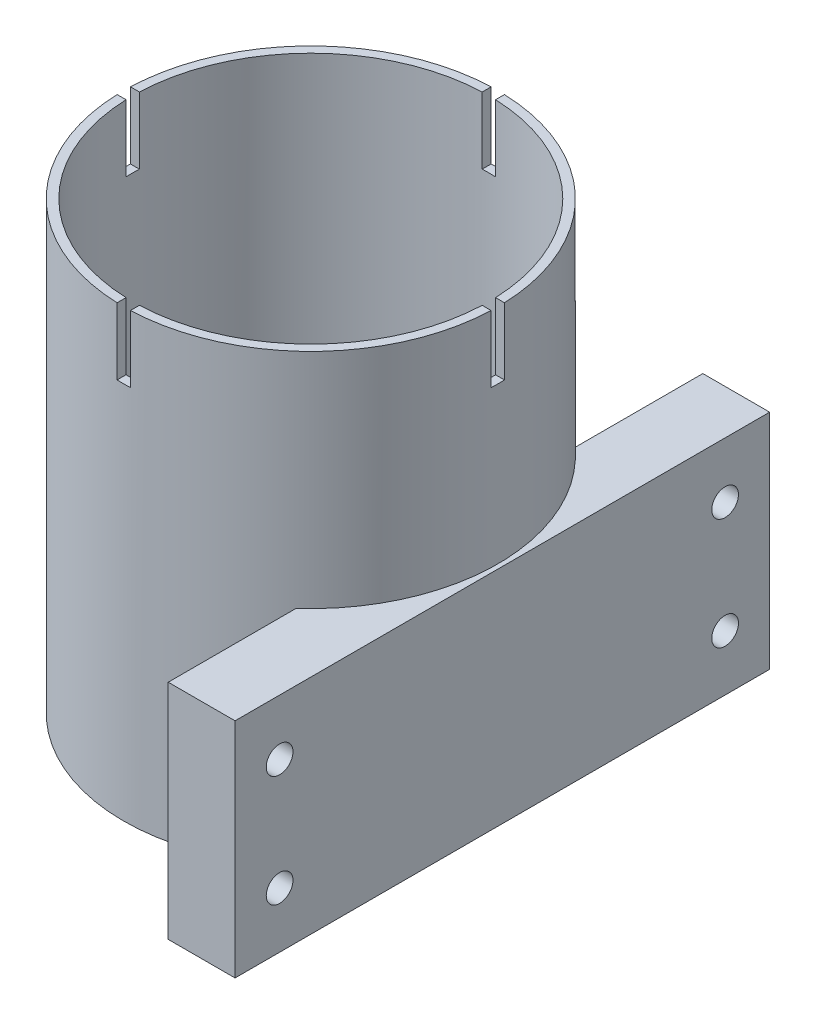
ISO-10303-21;
HEADER;
FILE_DESCRIPTION(('STEP AP214'),'2;1');
FILE_NAME('part.step','',(''),(''),'','','');
FILE_SCHEMA(('AUTOMOTIVE_DESIGN { 1 0 10303 214 1 1 1 1 }'));
ENDSEC;
DATA;
#1=APPLICATION_CONTEXT('core data for automotive mechanical design processes');
#2=APPLICATION_PROTOCOL_DEFINITION('international standard','automotive_design',2000,#1);
#3=PRODUCT_CONTEXT('',#1,'mechanical');
#4=PRODUCT('Part','Part','',(#3));
#5=PRODUCT_RELATED_PRODUCT_CATEGORY('part','',(#4));
#6=PRODUCT_DEFINITION_FORMATION('','',#4);
#7=PRODUCT_DEFINITION_CONTEXT('part definition',#1,'design');
#8=PRODUCT_DEFINITION('design','',#6,#7);
#9=PRODUCT_DEFINITION_SHAPE('','',#8);
#10=(LENGTH_UNIT() NAMED_UNIT(*) SI_UNIT(.MILLI.,.METRE.));
#11=(NAMED_UNIT(*) PLANE_ANGLE_UNIT() SI_UNIT($,.RADIAN.));
#12=(NAMED_UNIT(*) SI_UNIT($,.STERADIAN.) SOLID_ANGLE_UNIT());
#13=UNCERTAINTY_MEASURE_WITH_UNIT(LENGTH_MEASURE(1.E-05),#10,'distance_accuracy_value','');
#14=(GEOMETRIC_REPRESENTATION_CONTEXT(3) GLOBAL_UNCERTAINTY_ASSIGNED_CONTEXT((#13)) GLOBAL_UNIT_ASSIGNED_CONTEXT((#10,
#11,#12)) REPRESENTATION_CONTEXT('',''));
#15=CARTESIAN_POINT('',(0.,0.,0.));
#16=DIRECTION('',(0.,0.,1.));
#17=DIRECTION('',(1.,0.,0.));
#18=AXIS2_PLACEMENT_3D('',#15,#16,#17);
#19=CARTESIAN_POINT('',(0.,100.,0.));
#20=DIRECTION('',(0.,-1.,0.));
#21=DIRECTION('',(0.,0.,-1.));
#22=AXIS2_PLACEMENT_3D('',#19,#20,#21);
#23=CYLINDRICAL_SURFACE('',#22,42.);
#24=CARTESIAN_POINT('',(0.,85.,0.));
#25=DIRECTION('',(0.,-1.,0.));
#26=DIRECTION('',(0.,0.,-1.));
#27=AXIS2_PLACEMENT_3D('',#24,#25,#26);
#28=CIRCLE('',#27,42.);
#29=CARTESIAN_POINT('',(41.9732057388997,85.,-1.5));
#30=VERTEX_POINT('',#29);
#31=CARTESIAN_POINT('',(41.9732057388997,85.,1.5));
#32=VERTEX_POINT('',#31);
#33=EDGE_CURVE('E275',#30,#32,#28,.T.);
#34=ORIENTED_EDGE('',*,*,#33,.T.);
#35=DIRECTION('',(0.,-1.,0.));
#36=VECTOR('',#35,1.);
#37=CARTESIAN_POINT('',(41.9732057388997,100.,1.5));
#38=LINE('',#37,#36);
#39=CARTESIAN_POINT('',(41.9732057388997,100.,1.5));
#40=VERTEX_POINT('',#39);
#41=EDGE_CURVE('E297',#32,#40,#38,.F.);
#42=ORIENTED_EDGE('',*,*,#41,.T.);
#43=CARTESIAN_POINT('',(0.,100.,0.));
#44=DIRECTION('',(0.,1.,0.));
#45=DIRECTION('',(0.,0.,1.));
#46=AXIS2_PLACEMENT_3D('',#43,#44,#45);
#47=CIRCLE('',#46,42.);
#48=CARTESIAN_POINT('',(1.50000000000001,100.,41.9732057388997));
#49=VERTEX_POINT('',#48);
#50=EDGE_CURVE('E317',#49,#40,#47,.T.);
#51=ORIENTED_EDGE('',*,*,#50,.F.);
#52=DIRECTION('',(0.,-1.,0.));
#53=VECTOR('',#52,1.);
#54=CARTESIAN_POINT('',(1.50000000000001,100.,41.9732057388997));
#55=LINE('',#54,#53);
#56=CARTESIAN_POINT('',(1.50000000000001,85.,41.9732057388997));
#57=VERTEX_POINT('',#56);
#58=EDGE_CURVE('E294',#49,#57,#55,.T.);
#59=ORIENTED_EDGE('',*,*,#58,.T.);
#60=CARTESIAN_POINT('',(-1.5,85.,41.9732057388997));
#61=VERTEX_POINT('',#60);
#62=EDGE_CURVE('E380',#57,#61,#28,.T.);
#63=ORIENTED_EDGE('',*,*,#62,.T.);
#64=DIRECTION('',(0.,-1.,0.));
#65=VECTOR('',#64,1.);
#66=CARTESIAN_POINT('',(-1.5,100.,41.9732057388997));
#67=LINE('',#66,#65);
#68=CARTESIAN_POINT('',(-1.49999999999999,100.,41.9732057388997));
#69=VERTEX_POINT('',#68);
#70=EDGE_CURVE('E291',#61,#69,#67,.F.);
#71=ORIENTED_EDGE('',*,*,#70,.T.);
#72=CARTESIAN_POINT('',(-41.9732057388997,100.,1.5));
#73=VERTEX_POINT('',#72);
#74=EDGE_CURVE('E322',#73,#69,#47,.T.);
#75=ORIENTED_EDGE('',*,*,#74,.F.);
#76=DIRECTION('',(0.,-1.,0.));
#77=VECTOR('',#76,1.);
#78=CARTESIAN_POINT('',(-41.9732057388997,100.,1.5));
#79=LINE('',#78,#77);
#80=CARTESIAN_POINT('',(-41.9732057388997,85.,1.5));
#81=VERTEX_POINT('',#80);
#82=EDGE_CURVE('E288',#73,#81,#79,.T.);
#83=ORIENTED_EDGE('',*,*,#82,.T.);
#84=CARTESIAN_POINT('',(-41.9732057388997,85.,-1.5));
#85=VERTEX_POINT('',#84);
#86=EDGE_CURVE('E274',#81,#85,#28,.T.);
#87=ORIENTED_EDGE('',*,*,#86,.T.);
#88=DIRECTION('',(0.,-1.,0.));
#89=VECTOR('',#88,1.);
#90=CARTESIAN_POINT('',(-41.9732057388997,100.,-1.5));
#91=LINE('',#90,#89);
#92=CARTESIAN_POINT('',(-41.9732057388997,100.,-1.5));
#93=VERTEX_POINT('',#92);
#94=EDGE_CURVE('E285',#85,#93,#91,.F.);
#95=ORIENTED_EDGE('',*,*,#94,.T.);
#96=CARTESIAN_POINT('',(-1.50000000000001,100.,-41.9732057388997));
#97=VERTEX_POINT('',#96);
#98=EDGE_CURVE('E421',#97,#93,#47,.T.);
#99=ORIENTED_EDGE('',*,*,#98,.F.);
#100=DIRECTION('',(0.,-1.,0.));
#101=VECTOR('',#100,1.);
#102=CARTESIAN_POINT('',(-1.50000000000001,100.,-41.9732057388997));
#103=LINE('',#102,#101);
#104=CARTESIAN_POINT('',(-1.50000000000001,85.,-41.9732057388997));
#105=VERTEX_POINT('',#104);
#106=EDGE_CURVE('E282',#97,#105,#103,.T.);
#107=ORIENTED_EDGE('',*,*,#106,.T.);
#108=CARTESIAN_POINT('',(1.5,85.,-41.9732057388997));
#109=VERTEX_POINT('',#108);
#110=EDGE_CURVE('E257',#105,#109,#28,.T.);
#111=ORIENTED_EDGE('',*,*,#110,.T.);
#112=DIRECTION('',(0.,-1.,0.));
#113=VECTOR('',#112,1.);
#114=CARTESIAN_POINT('',(1.5,100.,-41.9732057388997));
#115=LINE('',#114,#113);
#116=CARTESIAN_POINT('',(1.49999999999999,100.,-41.9732057388997));
#117=VERTEX_POINT('',#116);
#118=EDGE_CURVE('E279',#109,#117,#115,.F.);
#119=ORIENTED_EDGE('',*,*,#118,.T.);
#120=CARTESIAN_POINT('',(41.9732057388997,100.,-1.5));
#121=VERTEX_POINT('',#120);
#122=EDGE_CURVE('E321',#121,#117,#47,.T.);
#123=ORIENTED_EDGE('',*,*,#122,.F.);
#124=DIRECTION('',(0.,-1.,0.));
#125=VECTOR('',#124,1.);
#126=CARTESIAN_POINT('',(41.9732057388997,100.,-1.5));
#127=LINE('',#126,#125);
#128=EDGE_CURVE('E276',#121,#30,#127,.T.);
#129=ORIENTED_EDGE('',*,*,#128,.T.);
#130=EDGE_LOOP('',(#34,#42,#51,#59,#63,#71,#75,#83,#87,#95,#99,#107,#111,#119,#123,#129));
#131=FACE_BOUND('',#130,.T.);
#132=DIRECTION('',(0.,-1.,0.));
#133=VECTOR('',#132,1.);
#134=CARTESIAN_POINT('',(28.,50.,-31.3049516849971));
#135=LINE('',#134,#133);
#136=CARTESIAN_POINT('',(28.,50.,-31.3049516849971));
#137=VERTEX_POINT('',#136);
#138=CARTESIAN_POINT('',(28.,0.,-31.3049516849971));
#139=VERTEX_POINT('',#138);
#140=EDGE_CURVE('E229',#137,#139,#135,.T.);
#141=ORIENTED_EDGE('',*,*,#140,.T.);
#142=CARTESIAN_POINT('',(0.,0.,0.));
#143=DIRECTION('',(0.,1.,0.));
#144=DIRECTION('',(0.,0.,1.));
#145=AXIS2_PLACEMENT_3D('',#142,#143,#144);
#146=CIRCLE('',#145,42.);
#147=CARTESIAN_POINT('',(28.,0.,31.3049516849971));
#148=VERTEX_POINT('',#147);
#149=EDGE_CURVE('E311',#139,#148,#146,.T.);
#150=ORIENTED_EDGE('',*,*,#149,.T.);
#151=DIRECTION('',(0.,-1.,0.));
#152=VECTOR('',#151,1.);
#153=CARTESIAN_POINT('',(28.,50.,31.3049516849971));
#154=LINE('',#153,#152);
#155=CARTESIAN_POINT('',(28.,50.,31.3049516849971));
#156=VERTEX_POINT('',#155);
#157=EDGE_CURVE('E48',#156,#148,#154,.T.);
#158=ORIENTED_EDGE('',*,*,#157,.F.);
#159=CARTESIAN_POINT('',(0.,50.,0.));
#160=DIRECTION('',(0.,-1.,0.));
#161=DIRECTION('',(0.,0.,-1.));
#162=AXIS2_PLACEMENT_3D('',#159,#160,#161);
#163=CIRCLE('',#162,42.);
#164=EDGE_CURVE('E52',#137,#156,#163,.T.);
#165=ORIENTED_EDGE('',*,*,#164,.F.);
#166=EDGE_LOOP('',(#141,#150,#158,#165));
#167=FACE_BOUND('',#166,.T.);
#168=ADVANCED_FACE('F34',(#131,#167),#23,.T.);
#169=CARTESIAN_POINT('',(0.,100.,0.));
#170=DIRECTION('',(0.,1.,0.));
#171=DIRECTION('',(0.,0.,1.));
#172=AXIS2_PLACEMENT_3D('',#169,#170,#171);
#173=PLANE('',#172);
#174=DIRECTION('',(1.,0.,0.));
#175=VECTOR('',#174,1.);
#176=CARTESIAN_POINT('',(1.5,100.,1.5));
#177=LINE('',#176,#175);
#178=CARTESIAN_POINT('',(39.9718651053463,100.,1.5));
#179=VERTEX_POINT('',#178);
#180=EDGE_CURVE('E239',#179,#40,#177,.T.);
#181=ORIENTED_EDGE('',*,*,#180,.F.);
#182=CARTESIAN_POINT('',(0.,100.,0.));
#183=DIRECTION('',(0.,1.,0.));
#184=DIRECTION('',(0.,0.,1.));
#185=AXIS2_PLACEMENT_3D('',#182,#183,#184);
#186=CIRCLE('',#185,40.);
#187=CARTESIAN_POINT('',(1.5,100.,39.9718651053463));
#188=VERTEX_POINT('',#187);
#189=EDGE_CURVE('E312',#188,#179,#186,.T.);
#190=ORIENTED_EDGE('',*,*,#189,.F.);
#191=DIRECTION('',(0.,0.,-1.));
#192=VECTOR('',#191,1.);
#193=CARTESIAN_POINT('',(1.5,100.,1.5));
#194=LINE('',#193,#192);
#195=EDGE_CURVE('E269',#49,#188,#194,.T.);
#196=ORIENTED_EDGE('',*,*,#195,.F.);
#197=ORIENTED_EDGE('',*,*,#50,.T.);
#198=EDGE_LOOP('',(#181,#190,#196,#197));
#199=FACE_BOUND('',#198,.T.);
#200=ADVANCED_FACE('F373',(#199),#173,.T.);
#201=DIRECTION('',(0.,0.,1.));
#202=VECTOR('',#201,1.);
#203=CARTESIAN_POINT('',(-1.5,100.,1.5));
#204=LINE('',#203,#202);
#205=CARTESIAN_POINT('',(-1.5,100.,39.9718651053463));
#206=VERTEX_POINT('',#205);
#207=EDGE_CURVE('E267',#206,#69,#204,.T.);
#208=ORIENTED_EDGE('',*,*,#207,.F.);
#209=CARTESIAN_POINT('',(-39.9718651053463,100.,1.5));
#210=VERTEX_POINT('',#209);
#211=EDGE_CURVE('E316',#210,#206,#186,.T.);
#212=ORIENTED_EDGE('',*,*,#211,.F.);
#213=DIRECTION('',(1.,0.,0.));
#214=VECTOR('',#213,1.);
#215=CARTESIAN_POINT('',(-52.9403389802906,100.,1.5));
#216=LINE('',#215,#214);
#217=EDGE_CURVE('E265',#73,#210,#216,.T.);
#218=ORIENTED_EDGE('',*,*,#217,.F.);
#219=ORIENTED_EDGE('',*,*,#74,.T.);
#220=EDGE_LOOP('',(#208,#212,#218,#219));
#221=FACE_BOUND('',#220,.T.);
#222=ADVANCED_FACE('F399',(#221),#173,.T.);
#223=DIRECTION('',(-1.,0.,0.));
#224=VECTOR('',#223,1.);
#225=CARTESIAN_POINT('',(-52.9403389802906,100.,-1.5));
#226=LINE('',#225,#224);
#227=CARTESIAN_POINT('',(-39.9718651053463,100.,-1.5));
#228=VERTEX_POINT('',#227);
#229=EDGE_CURVE('E263',#228,#93,#226,.T.);
#230=ORIENTED_EDGE('',*,*,#229,.F.);
#231=CARTESIAN_POINT('',(-1.50000000000001,100.,-39.9718651053463));
#232=VERTEX_POINT('',#231);
#233=EDGE_CURVE('E400',#232,#228,#186,.T.);
#234=ORIENTED_EDGE('',*,*,#233,.F.);
#235=DIRECTION('',(0.,0.,1.));
#236=VECTOR('',#235,1.);
#237=CARTESIAN_POINT('',(-1.50000000000001,100.,-46.2988985871224));
#238=LINE('',#237,#236);
#239=EDGE_CURVE('E261',#97,#232,#238,.T.);
#240=ORIENTED_EDGE('',*,*,#239,.F.);
#241=ORIENTED_EDGE('',*,*,#98,.T.);
#242=EDGE_LOOP('',(#230,#234,#240,#241));
#243=FACE_BOUND('',#242,.T.);
#244=ADVANCED_FACE('F420',(#243),#173,.T.);
#245=DIRECTION('',(0.,0.,-1.));
#246=VECTOR('',#245,1.);
#247=CARTESIAN_POINT('',(1.49999999999999,100.,-46.2988985871224));
#248=LINE('',#247,#246);
#249=CARTESIAN_POINT('',(1.5,100.,-39.9718651053463));
#250=VERTEX_POINT('',#249);
#251=EDGE_CURVE('E259',#250,#117,#248,.T.);
#252=ORIENTED_EDGE('',*,*,#251,.F.);
#253=CARTESIAN_POINT('',(39.9718651053463,100.,-1.5));
#254=VERTEX_POINT('',#253);
#255=EDGE_CURVE('E315',#254,#250,#186,.T.);
#256=ORIENTED_EDGE('',*,*,#255,.F.);
#257=DIRECTION('',(-1.,0.,0.));
#258=VECTOR('',#257,1.);
#259=CARTESIAN_POINT('',(1.5,100.,-1.5));
#260=LINE('',#259,#258);
#261=EDGE_CURVE('E228',#121,#254,#260,.T.);
#262=ORIENTED_EDGE('',*,*,#261,.F.);
#263=ORIENTED_EDGE('',*,*,#122,.T.);
#264=EDGE_LOOP('',(#252,#256,#262,#263));
#265=FACE_BOUND('',#264,.T.);
#266=ADVANCED_FACE('F405',(#265),#173,.T.);
#267=CARTESIAN_POINT('',(0.,0.,0.));
#268=DIRECTION('',(0.,1.,0.));
#269=DIRECTION('',(0.,0.,1.));
#270=AXIS2_PLACEMENT_3D('',#267,#268,#269);
#271=PLANE('',#270);
#272=CARTESIAN_POINT('',(0.,0.,0.));
#273=DIRECTION('',(0.,-1.,0.));
#274=DIRECTION('',(0.,0.,-1.));
#275=AXIS2_PLACEMENT_3D('',#272,#273,#274);
#276=CIRCLE('',#275,10.);
#277=CARTESIAN_POINT('',(0.,0.,-10.));
#278=VERTEX_POINT('',#277);
#279=EDGE_CURVE('E300',#278,#278,#276,.T.);
#280=ORIENTED_EDGE('',*,*,#279,.F.);
#281=EDGE_LOOP('',(#280));
#282=FACE_BOUND('',#281,.T.);
#283=CARTESIAN_POINT('',(0.,0.,30.));
#284=DIRECTION('',(0.,-1.,0.));
#285=DIRECTION('',(0.,0.,-1.));
#286=AXIS2_PLACEMENT_3D('',#283,#284,#285);
#287=CIRCLE('',#286,5.5);
#288=CARTESIAN_POINT('',(0.,0.,24.5));
#289=VERTEX_POINT('',#288);
#290=EDGE_CURVE('E304',#289,#289,#287,.T.);
#291=ORIENTED_EDGE('',*,*,#290,.F.);
#292=EDGE_LOOP('',(#291));
#293=FACE_BOUND('',#292,.T.);
#294=ORIENTED_EDGE('',*,*,#149,.F.);
#295=DIRECTION('',(0.,0.,1.));
#296=VECTOR('',#295,1.);
#297=CARTESIAN_POINT('',(28.,0.,-60.));
#298=LINE('',#297,#296);
#299=CARTESIAN_POINT('',(28.,0.,-60.));
#300=VERTEX_POINT('',#299);
#301=EDGE_CURVE('E205',#300,#139,#298,.T.);
#302=ORIENTED_EDGE('',*,*,#301,.F.);
#303=DIRECTION('',(1.,0.,0.));
#304=VECTOR('',#303,1.);
#305=CARTESIAN_POINT('',(28.,0.,-60.));
#306=LINE('',#305,#304);
#307=CARTESIAN_POINT('',(43.,0.,-60.));
#308=VERTEX_POINT('',#307);
#309=EDGE_CURVE('E219',#300,#308,#306,.T.);
#310=ORIENTED_EDGE('',*,*,#309,.T.);
#311=DIRECTION('',(0.,0.,1.));
#312=VECTOR('',#311,1.);
#313=CARTESIAN_POINT('',(43.,0.,-60.));
#314=LINE('',#313,#312);
#315=CARTESIAN_POINT('',(43.,0.,60.));
#316=VERTEX_POINT('',#315);
#317=EDGE_CURVE('E186',#308,#316,#314,.T.);
#318=ORIENTED_EDGE('',*,*,#317,.T.);
#319=DIRECTION('',(1.,0.,0.));
#320=VECTOR('',#319,1.);
#321=CARTESIAN_POINT('',(28.,0.,60.));
#322=LINE('',#321,#320);
#323=CARTESIAN_POINT('',(28.,0.,60.));
#324=VERTEX_POINT('',#323);
#325=EDGE_CURVE('E223',#324,#316,#322,.T.);
#326=ORIENTED_EDGE('',*,*,#325,.F.);
#327=DIRECTION('',(0.,0.,1.));
#328=VECTOR('',#327,1.);
#329=CARTESIAN_POINT('',(28.,0.,31.3049516849971));
#330=LINE('',#329,#328);
#331=EDGE_CURVE('E208',#148,#324,#330,.T.);
#332=ORIENTED_EDGE('',*,*,#331,.F.);
#333=EDGE_LOOP('',(#294,#302,#310,#318,#326,#332));
#334=FACE_BOUND('',#333,.T.);
#335=ADVANCED_FACE('F444',(#282,#293,#334),#271,.F.);
#336=CARTESIAN_POINT('',(0.,2.,0.));
#337=DIRECTION('',(0.,1.,0.));
#338=DIRECTION('',(0.,0.,1.));
#339=AXIS2_PLACEMENT_3D('',#336,#337,#338);
#340=CYLINDRICAL_SURFACE('',#339,40.);
#341=CARTESIAN_POINT('',(0.,85.,0.));
#342=DIRECTION('',(0.,-1.,0.));
#343=DIRECTION('',(0.,0.,-1.));
#344=AXIS2_PLACEMENT_3D('',#341,#342,#343);
#345=CIRCLE('',#344,40.);
#346=CARTESIAN_POINT('',(-39.9718651053463,85.,-1.5));
#347=VERTEX_POINT('',#346);
#348=CARTESIAN_POINT('',(-39.9718651053463,85.,1.5));
#349=VERTEX_POINT('',#348);
#350=EDGE_CURVE('E331',#347,#349,#345,.F.);
#351=ORIENTED_EDGE('',*,*,#350,.T.);
#352=DIRECTION('',(0.,1.,0.));
#353=VECTOR('',#352,1.);
#354=CARTESIAN_POINT('',(-39.9718651053463,2.,1.5));
#355=LINE('',#354,#353);
#356=EDGE_CURVE('E11',#349,#210,#355,.T.);
#357=ORIENTED_EDGE('',*,*,#356,.T.);
#358=ORIENTED_EDGE('',*,*,#211,.T.);
#359=DIRECTION('',(0.,1.,0.));
#360=VECTOR('',#359,1.);
#361=CARTESIAN_POINT('',(-1.5,2.,39.9718651053463));
#362=LINE('',#361,#360);
#363=CARTESIAN_POINT('',(-1.5,85.,39.9718651053463));
#364=VERTEX_POINT('',#363);
#365=EDGE_CURVE('E345',#206,#364,#362,.F.);
#366=ORIENTED_EDGE('',*,*,#365,.T.);
#367=CARTESIAN_POINT('',(1.5,85.,39.9718651053463));
#368=VERTEX_POINT('',#367);
#369=EDGE_CURVE('E344',#364,#368,#345,.F.);
#370=ORIENTED_EDGE('',*,*,#369,.T.);
#371=DIRECTION('',(0.,1.,0.));
#372=VECTOR('',#371,1.);
#373=CARTESIAN_POINT('',(1.5,2.,39.9718651053463));
#374=LINE('',#373,#372);
#375=EDGE_CURVE('E348',#368,#188,#374,.T.);
#376=ORIENTED_EDGE('',*,*,#375,.T.);
#377=ORIENTED_EDGE('',*,*,#189,.T.);
#378=DIRECTION('',(0.,1.,0.));
#379=VECTOR('',#378,1.);
#380=CARTESIAN_POINT('',(39.9718651053463,2.,1.5));
#381=LINE('',#380,#379);
#382=CARTESIAN_POINT('',(39.9718651053463,85.,1.5));
#383=VERTEX_POINT('',#382);
#384=EDGE_CURVE('E341',#179,#383,#381,.F.);
#385=ORIENTED_EDGE('',*,*,#384,.T.);
#386=CARTESIAN_POINT('',(39.9718651053463,85.,-1.5));
#387=VERTEX_POINT('',#386);
#388=EDGE_CURVE('E332',#383,#387,#345,.F.);
#389=ORIENTED_EDGE('',*,*,#388,.T.);
#390=DIRECTION('',(0.,1.,0.));
#391=VECTOR('',#390,1.);
#392=CARTESIAN_POINT('',(39.9718651053463,2.,-1.5));
#393=LINE('',#392,#391);
#394=EDGE_CURVE('E338',#387,#254,#393,.T.);
#395=ORIENTED_EDGE('',*,*,#394,.T.);
#396=ORIENTED_EDGE('',*,*,#255,.T.);
#397=DIRECTION('',(0.,1.,0.));
#398=VECTOR('',#397,1.);
#399=CARTESIAN_POINT('',(1.5,2.,-39.9718651053463));
#400=LINE('',#399,#398);
#401=CARTESIAN_POINT('',(1.5,85.,-39.9718651053463));
#402=VERTEX_POINT('',#401);
#403=EDGE_CURVE('E330',#250,#402,#400,.F.);
#404=ORIENTED_EDGE('',*,*,#403,.T.);
#405=CARTESIAN_POINT('',(-1.50000000000001,85.,-39.9718651053463));
#406=VERTEX_POINT('',#405);
#407=EDGE_CURVE('E320',#402,#406,#345,.F.);
#408=ORIENTED_EDGE('',*,*,#407,.T.);
#409=DIRECTION('',(0.,1.,0.));
#410=VECTOR('',#409,1.);
#411=CARTESIAN_POINT('',(-1.50000000000001,2.,-39.9718651053463));
#412=LINE('',#411,#410);
#413=EDGE_CURVE('E335',#406,#232,#412,.T.);
#414=ORIENTED_EDGE('',*,*,#413,.T.);
#415=ORIENTED_EDGE('',*,*,#233,.T.);
#416=DIRECTION('',(0.,1.,0.));
#417=VECTOR('',#416,1.);
#418=CARTESIAN_POINT('',(-39.9718651053463,2.,-1.5));
#419=LINE('',#418,#417);
#420=EDGE_CURVE('E41',#228,#347,#419,.F.);
#421=ORIENTED_EDGE('',*,*,#420,.T.);
#422=EDGE_LOOP('',(#351,#357,#358,#366,#370,#376,#377,#385,#389,#395,#396,#404,#408,#414,#415,#421));
#423=FACE_BOUND('',#422,.T.);
#424=CARTESIAN_POINT('',(0.,2.,0.));
#425=DIRECTION('',(0.,1.,0.));
#426=DIRECTION('',(0.,0.,1.));
#427=AXIS2_PLACEMENT_3D('',#424,#425,#426);
#428=CIRCLE('',#427,40.);
#429=CARTESIAN_POINT('',(0.,2.,40.));
#430=VERTEX_POINT('',#429);
#431=EDGE_CURVE('E308',#430,#430,#428,.T.);
#432=ORIENTED_EDGE('',*,*,#431,.F.);
#433=EDGE_LOOP('',(#432));
#434=FACE_BOUND('',#433,.T.);
#435=ADVANCED_FACE('F356',(#423,#434),#340,.F.);
#436=CARTESIAN_POINT('',(0.,2.,0.));
#437=DIRECTION('',(0.,1.,0.));
#438=DIRECTION('',(0.,0.,1.));
#439=AXIS2_PLACEMENT_3D('',#436,#437,#438);
#440=PLANE('',#439);
#441=CARTESIAN_POINT('',(0.,2.,0.));
#442=DIRECTION('',(0.,1.,0.));
#443=DIRECTION('',(0.,0.,1.));
#444=AXIS2_PLACEMENT_3D('',#441,#442,#443);
#445=CIRCLE('',#444,10.);
#446=CARTESIAN_POINT('',(0.,2.,10.));
#447=VERTEX_POINT('',#446);
#448=EDGE_CURVE('E303',#447,#447,#445,.T.);
#449=ORIENTED_EDGE('',*,*,#448,.F.);
#450=EDGE_LOOP('',(#449));
#451=FACE_BOUND('',#450,.T.);
#452=CARTESIAN_POINT('',(0.,2.,30.));
#453=DIRECTION('',(0.,1.,0.));
#454=DIRECTION('',(0.,0.,1.));
#455=AXIS2_PLACEMENT_3D('',#452,#453,#454);
#456=CIRCLE('',#455,5.5);
#457=CARTESIAN_POINT('',(0.,2.,35.5));
#458=VERTEX_POINT('',#457);
#459=EDGE_CURVE('E307',#458,#458,#456,.T.);
#460=ORIENTED_EDGE('',*,*,#459,.F.);
#461=EDGE_LOOP('',(#460));
#462=FACE_BOUND('',#461,.T.);
#463=ORIENTED_EDGE('',*,*,#431,.T.);
#464=EDGE_LOOP('',(#463));
#465=FACE_BOUND('',#464,.T.);
#466=ADVANCED_FACE('F480',(#451,#462,#465),#440,.T.);
#467=CARTESIAN_POINT('',(0.,100.,30.));
#468=DIRECTION('',(0.,-1.,0.));
#469=DIRECTION('',(0.,0.,-1.));
#470=AXIS2_PLACEMENT_3D('',#467,#468,#469);
#471=CYLINDRICAL_SURFACE('',#470,5.5);
#472=ORIENTED_EDGE('',*,*,#459,.T.);
#473=EDGE_LOOP('',(#472));
#474=FACE_BOUND('',#473,.T.);
#475=ORIENTED_EDGE('',*,*,#290,.T.);
#476=EDGE_LOOP('',(#475));
#477=FACE_BOUND('',#476,.T.);
#478=ADVANCED_FACE('F471',(#474,#477),#471,.F.);
#479=CARTESIAN_POINT('',(0.,100.,0.));
#480=DIRECTION('',(0.,-1.,0.));
#481=DIRECTION('',(0.,0.,-1.));
#482=AXIS2_PLACEMENT_3D('',#479,#480,#481);
#483=CYLINDRICAL_SURFACE('',#482,10.);
#484=ORIENTED_EDGE('',*,*,#448,.T.);
#485=EDGE_LOOP('',(#484));
#486=FACE_BOUND('',#485,.T.);
#487=ORIENTED_EDGE('',*,*,#279,.T.);
#488=EDGE_LOOP('',(#487));
#489=FACE_BOUND('',#488,.T.);
#490=ADVANCED_FACE('F466',(#486,#489),#483,.F.);
#491=CARTESIAN_POINT('',(0.,85.,0.));
#492=DIRECTION('',(0.,-1.,0.));
#493=DIRECTION('',(0.,0.,-1.));
#494=AXIS2_PLACEMENT_3D('',#491,#492,#493);
#495=PLANE('',#494);
#496=DIRECTION('',(0.,0.,1.));
#497=VECTOR('',#496,1.);
#498=CARTESIAN_POINT('',(-1.50000000000001,85.,-46.2988985871224));
#499=LINE('',#498,#497);
#500=EDGE_CURVE('E242',#105,#406,#499,.T.);
#501=ORIENTED_EDGE('',*,*,#500,.T.);
#502=ORIENTED_EDGE('',*,*,#407,.F.);
#503=DIRECTION('',(0.,0.,-1.));
#504=VECTOR('',#503,1.);
#505=CARTESIAN_POINT('',(1.49999999999999,85.,-46.2988985871224));
#506=LINE('',#505,#504);
#507=EDGE_CURVE('E238',#402,#109,#506,.T.);
#508=ORIENTED_EDGE('',*,*,#507,.T.);
#509=ORIENTED_EDGE('',*,*,#110,.F.);
#510=EDGE_LOOP('',(#501,#502,#508,#509));
#511=FACE_BOUND('',#510,.T.);
#512=ADVANCED_FACE('F413',(#511),#495,.F.);
#513=CARTESIAN_POINT('',(1.49999999999999,85.,-46.2988985871224));
#514=DIRECTION('',(1.,0.,0.));
#515=DIRECTION('',(0.,0.,-1.));
#516=AXIS2_PLACEMENT_3D('',#513,#514,#515);
#517=PLANE('',#516);
#518=ORIENTED_EDGE('',*,*,#507,.F.);
#519=ORIENTED_EDGE('',*,*,#403,.F.);
#520=ORIENTED_EDGE('',*,*,#251,.T.);
#521=ORIENTED_EDGE('',*,*,#118,.F.);
#522=EDGE_LOOP('',(#518,#519,#520,#521));
#523=FACE_BOUND('',#522,.T.);
#524=ADVANCED_FACE('F410',(#523),#517,.F.);
#525=CARTESIAN_POINT('',(-1.50000000000001,85.,-46.2988985871224));
#526=DIRECTION('',(-1.,0.,0.));
#527=DIRECTION('',(0.,0.,1.));
#528=AXIS2_PLACEMENT_3D('',#525,#526,#527);
#529=PLANE('',#528);
#530=ORIENTED_EDGE('',*,*,#239,.T.);
#531=ORIENTED_EDGE('',*,*,#413,.F.);
#532=ORIENTED_EDGE('',*,*,#500,.F.);
#533=ORIENTED_EDGE('',*,*,#106,.F.);
#534=EDGE_LOOP('',(#530,#531,#532,#533));
#535=FACE_BOUND('',#534,.T.);
#536=ADVANCED_FACE('F416',(#535),#529,.F.);
#537=DIRECTION('',(-1.,0.,0.));
#538=VECTOR('',#537,1.);
#539=CARTESIAN_POINT('',(1.5,85.,-1.5));
#540=LINE('',#539,#538);
#541=EDGE_CURVE('E236',#30,#387,#540,.T.);
#542=ORIENTED_EDGE('',*,*,#541,.T.);
#543=ORIENTED_EDGE('',*,*,#388,.F.);
#544=DIRECTION('',(1.,0.,0.));
#545=VECTOR('',#544,1.);
#546=CARTESIAN_POINT('',(1.5,85.,1.5));
#547=LINE('',#546,#545);
#548=EDGE_CURVE('E254',#383,#32,#547,.T.);
#549=ORIENTED_EDGE('',*,*,#548,.T.);
#550=ORIENTED_EDGE('',*,*,#33,.F.);
#551=EDGE_LOOP('',(#542,#543,#549,#550));
#552=FACE_BOUND('',#551,.T.);
#553=ADVANCED_FACE('F363',(#552),#495,.F.);
#554=CARTESIAN_POINT('',(1.5,85.,-1.5));
#555=DIRECTION('',(0.,0.,-1.));
#556=DIRECTION('',(-1.,0.,0.));
#557=AXIS2_PLACEMENT_3D('',#554,#555,#556);
#558=PLANE('',#557);
#559=ORIENTED_EDGE('',*,*,#261,.T.);
#560=ORIENTED_EDGE('',*,*,#394,.F.);
#561=ORIENTED_EDGE('',*,*,#541,.F.);
#562=ORIENTED_EDGE('',*,*,#128,.F.);
#563=EDGE_LOOP('',(#559,#560,#561,#562));
#564=FACE_BOUND('',#563,.T.);
#565=ADVANCED_FACE('F613',(#564),#558,.F.);
#566=CARTESIAN_POINT('',(1.5,85.,1.5));
#567=DIRECTION('',(0.,0.,1.));
#568=DIRECTION('',(1.,0.,0.));
#569=AXIS2_PLACEMENT_3D('',#566,#567,#568);
#570=PLANE('',#569);
#571=ORIENTED_EDGE('',*,*,#548,.F.);
#572=ORIENTED_EDGE('',*,*,#384,.F.);
#573=ORIENTED_EDGE('',*,*,#180,.T.);
#574=ORIENTED_EDGE('',*,*,#41,.F.);
#575=EDGE_LOOP('',(#571,#572,#573,#574));
#576=FACE_BOUND('',#575,.T.);
#577=ADVANCED_FACE('F367',(#576),#570,.F.);
#578=DIRECTION('',(0.,0.,-1.));
#579=VECTOR('',#578,1.);
#580=CARTESIAN_POINT('',(1.5,85.,1.5));
#581=LINE('',#580,#579);
#582=EDGE_CURVE('E252',#57,#368,#581,.T.);
#583=ORIENTED_EDGE('',*,*,#582,.T.);
#584=ORIENTED_EDGE('',*,*,#369,.F.);
#585=DIRECTION('',(0.,0.,1.));
#586=VECTOR('',#585,1.);
#587=CARTESIAN_POINT('',(-1.5,85.,1.5));
#588=LINE('',#587,#586);
#589=EDGE_CURVE('E249',#364,#61,#588,.T.);
#590=ORIENTED_EDGE('',*,*,#589,.T.);
#591=ORIENTED_EDGE('',*,*,#62,.F.);
#592=EDGE_LOOP('',(#583,#584,#590,#591));
#593=FACE_BOUND('',#592,.T.);
#594=ADVANCED_FACE('F431',(#593),#495,.F.);
#595=CARTESIAN_POINT('',(-1.5,85.,1.5));
#596=DIRECTION('',(-1.,0.,0.));
#597=DIRECTION('',(0.,0.,1.));
#598=AXIS2_PLACEMENT_3D('',#595,#596,#597);
#599=PLANE('',#598);
#600=ORIENTED_EDGE('',*,*,#589,.F.);
#601=ORIENTED_EDGE('',*,*,#365,.F.);
#602=ORIENTED_EDGE('',*,*,#207,.T.);
#603=ORIENTED_EDGE('',*,*,#70,.F.);
#604=EDGE_LOOP('',(#600,#601,#602,#603));
#605=FACE_BOUND('',#604,.T.);
#606=ADVANCED_FACE('F618',(#605),#599,.F.);
#607=CARTESIAN_POINT('',(1.5,85.,1.5));
#608=DIRECTION('',(1.,0.,0.));
#609=DIRECTION('',(0.,0.,-1.));
#610=AXIS2_PLACEMENT_3D('',#607,#608,#609);
#611=PLANE('',#610);
#612=ORIENTED_EDGE('',*,*,#195,.T.);
#613=ORIENTED_EDGE('',*,*,#375,.F.);
#614=ORIENTED_EDGE('',*,*,#582,.F.);
#615=ORIENTED_EDGE('',*,*,#58,.F.);
#616=EDGE_LOOP('',(#612,#613,#614,#615));
#617=FACE_BOUND('',#616,.T.);
#618=ADVANCED_FACE('F377',(#617),#611,.F.);
#619=CARTESIAN_POINT('',(-52.9403389802906,85.,1.5));
#620=DIRECTION('',(0.,0.,1.));
#621=DIRECTION('',(1.,0.,0.));
#622=AXIS2_PLACEMENT_3D('',#619,#620,#621);
#623=PLANE('',#622);
#624=ORIENTED_EDGE('',*,*,#217,.T.);
#625=ORIENTED_EDGE('',*,*,#356,.F.);
#626=DIRECTION('',(1.,0.,0.));
#627=VECTOR('',#626,1.);
#628=CARTESIAN_POINT('',(-52.9403389802906,85.,1.5));
#629=LINE('',#628,#627);
#630=EDGE_CURVE('E247',#81,#349,#629,.T.);
#631=ORIENTED_EDGE('',*,*,#630,.F.);
#632=ORIENTED_EDGE('',*,*,#82,.F.);
#633=EDGE_LOOP('',(#624,#625,#631,#632));
#634=FACE_BOUND('',#633,.T.);
#635=ADVANCED_FACE('F393',(#634),#623,.F.);
#636=CARTESIAN_POINT('',(-52.9403389802906,85.,-1.5));
#637=DIRECTION('',(0.,0.,-1.));
#638=DIRECTION('',(-1.,0.,0.));
#639=AXIS2_PLACEMENT_3D('',#636,#637,#638);
#640=PLANE('',#639);
#641=DIRECTION('',(-1.,0.,0.));
#642=VECTOR('',#641,1.);
#643=CARTESIAN_POINT('',(-52.9403389802906,85.,-1.5));
#644=LINE('',#643,#642);
#645=EDGE_CURVE('E244',#347,#85,#644,.T.);
#646=ORIENTED_EDGE('',*,*,#645,.F.);
#647=ORIENTED_EDGE('',*,*,#420,.F.);
#648=ORIENTED_EDGE('',*,*,#229,.T.);
#649=ORIENTED_EDGE('',*,*,#94,.F.);
#650=EDGE_LOOP('',(#646,#647,#648,#649));
#651=FACE_BOUND('',#650,.T.);
#652=ADVANCED_FACE('F423',(#651),#640,.F.);
#653=ORIENTED_EDGE('',*,*,#630,.T.);
#654=ORIENTED_EDGE('',*,*,#350,.F.);
#655=ORIENTED_EDGE('',*,*,#645,.T.);
#656=ORIENTED_EDGE('',*,*,#86,.F.);
#657=EDGE_LOOP('',(#653,#654,#655,#656));
#658=FACE_BOUND('',#657,.T.);
#659=ADVANCED_FACE('F389',(#658),#495,.F.);
#660=CARTESIAN_POINT('',(28.,50.,-60.));
#661=DIRECTION('',(0.,0.,-1.));
#662=DIRECTION('',(-1.,0.,0.));
#663=AXIS2_PLACEMENT_3D('',#660,#661,#662);
#664=PLANE('',#663);
#665=ORIENTED_EDGE('',*,*,#309,.F.);
#666=DIRECTION('',(0.,-1.,0.));
#667=VECTOR('',#666,1.);
#668=CARTESIAN_POINT('',(28.,50.,-60.));
#669=LINE('',#668,#667);
#670=CARTESIAN_POINT('',(28.,50.,-60.));
#671=VERTEX_POINT('',#670);
#672=EDGE_CURVE('E203',#671,#300,#669,.T.);
#673=ORIENTED_EDGE('',*,*,#672,.F.);
#674=DIRECTION('',(1.,0.,0.));
#675=VECTOR('',#674,1.);
#676=CARTESIAN_POINT('',(28.,50.,-60.));
#677=LINE('',#676,#675);
#678=CARTESIAN_POINT('',(43.,50.,-60.));
#679=VERTEX_POINT('',#678);
#680=EDGE_CURVE('E197',#671,#679,#677,.T.);
#681=ORIENTED_EDGE('',*,*,#680,.T.);
#682=DIRECTION('',(0.,-1.,0.));
#683=VECTOR('',#682,1.);
#684=CARTESIAN_POINT('',(43.,50.,-60.));
#685=LINE('',#684,#683);
#686=EDGE_CURVE('E181',#679,#308,#685,.T.);
#687=ORIENTED_EDGE('',*,*,#686,.T.);
#688=EDGE_LOOP('',(#665,#673,#681,#687));
#689=FACE_BOUND('',#688,.T.);
#690=ADVANCED_FACE('F202',(#689),#664,.T.);
#691=CARTESIAN_POINT('',(28.,50.,-60.));
#692=DIRECTION('',(1.,0.,0.));
#693=DIRECTION('',(0.,0.,-1.));
#694=AXIS2_PLACEMENT_3D('',#691,#692,#693);
#695=PLANE('',#694);
#696=CARTESIAN_POINT('',(28.,12.5,-50.));
#697=DIRECTION('',(-1.,0.,0.));
#698=DIRECTION('',(0.,0.,-1.));
#699=AXIS2_PLACEMENT_3D('',#696,#697,#698);
#700=CIRCLE('',#699,3.);
#701=CARTESIAN_POINT('',(28.,12.5,-53.));
#702=VERTEX_POINT('',#701);
#703=EDGE_CURVE('E706',#702,#702,#700,.T.);
#704=ORIENTED_EDGE('',*,*,#703,.F.);
#705=EDGE_LOOP('',(#704));
#706=FACE_BOUND('',#705,.T.);
#707=CARTESIAN_POINT('',(28.,37.5,-50.));
#708=DIRECTION('',(-1.,0.,0.));
#709=DIRECTION('',(0.,0.,-1.));
#710=AXIS2_PLACEMENT_3D('',#707,#708,#709);
#711=CIRCLE('',#710,3.);
#712=CARTESIAN_POINT('',(28.,37.5,-53.));
#713=VERTEX_POINT('',#712);
#714=EDGE_CURVE('E714',#713,#713,#711,.T.);
#715=ORIENTED_EDGE('',*,*,#714,.F.);
#716=EDGE_LOOP('',(#715));
#717=FACE_BOUND('',#716,.T.);
#718=ORIENTED_EDGE('',*,*,#301,.T.);
#719=ORIENTED_EDGE('',*,*,#140,.F.);
#720=DIRECTION('',(0.,0.,1.));
#721=VECTOR('',#720,1.);
#722=CARTESIAN_POINT('',(28.,50.,-60.));
#723=LINE('',#722,#721);
#724=EDGE_CURVE('E192',#671,#137,#723,.T.);
#725=ORIENTED_EDGE('',*,*,#724,.F.);
#726=ORIENTED_EDGE('',*,*,#672,.T.);
#727=EDGE_LOOP('',(#718,#719,#725,#726));
#728=FACE_BOUND('',#727,.T.);
#729=ADVANCED_FACE('F519',(#706,#717,#728),#695,.F.);
#730=CARTESIAN_POINT('',(28.,50.,31.3049516849971));
#731=DIRECTION('',(1.,0.,0.));
#732=DIRECTION('',(0.,0.,-1.));
#733=AXIS2_PLACEMENT_3D('',#730,#731,#732);
#734=PLANE('',#733);
#735=CARTESIAN_POINT('',(28.,12.5,50.));
#736=DIRECTION('',(-1.,0.,0.));
#737=DIRECTION('',(0.,0.,1.));
#738=AXIS2_PLACEMENT_3D('',#735,#736,#737);
#739=CIRCLE('',#738,3.);
#740=CARTESIAN_POINT('',(28.,12.5,53.));
#741=VERTEX_POINT('',#740);
#742=EDGE_CURVE('E701',#741,#741,#739,.T.);
#743=ORIENTED_EDGE('',*,*,#742,.F.);
#744=EDGE_LOOP('',(#743));
#745=FACE_BOUND('',#744,.T.);
#746=CARTESIAN_POINT('',(28.,37.5,50.));
#747=DIRECTION('',(-1.,0.,0.));
#748=DIRECTION('',(0.,0.,1.));
#749=AXIS2_PLACEMENT_3D('',#746,#747,#748);
#750=CIRCLE('',#749,3.);
#751=CARTESIAN_POINT('',(28.,37.5,53.));
#752=VERTEX_POINT('',#751);
#753=EDGE_CURVE('E211',#752,#752,#750,.T.);
#754=ORIENTED_EDGE('',*,*,#753,.F.);
#755=EDGE_LOOP('',(#754));
#756=FACE_BOUND('',#755,.T.);
#757=ORIENTED_EDGE('',*,*,#331,.T.);
#758=DIRECTION('',(0.,-1.,0.));
#759=VECTOR('',#758,1.);
#760=CARTESIAN_POINT('',(28.,50.,60.));
#761=LINE('',#760,#759);
#762=CARTESIAN_POINT('',(28.,50.,60.));
#763=VERTEX_POINT('',#762);
#764=EDGE_CURVE('E232',#763,#324,#761,.T.);
#765=ORIENTED_EDGE('',*,*,#764,.F.);
#766=DIRECTION('',(0.,0.,1.));
#767=VECTOR('',#766,1.);
#768=CARTESIAN_POINT('',(28.,50.,31.3049516849971));
#769=LINE('',#768,#767);
#770=EDGE_CURVE('E215',#156,#763,#769,.T.);
#771=ORIENTED_EDGE('',*,*,#770,.F.);
#772=ORIENTED_EDGE('',*,*,#157,.T.);
#773=EDGE_LOOP('',(#757,#765,#771,#772));
#774=FACE_BOUND('',#773,.T.);
#775=ADVANCED_FACE('F531',(#745,#756,#774),#734,.F.);
#776=CARTESIAN_POINT('',(28.,50.,60.));
#777=DIRECTION('',(0.,0.,-1.));
#778=DIRECTION('',(-1.,0.,0.));
#779=AXIS2_PLACEMENT_3D('',#776,#777,#778);
#780=PLANE('',#779);
#781=ORIENTED_EDGE('',*,*,#325,.T.);
#782=DIRECTION('',(0.,-1.,0.));
#783=VECTOR('',#782,1.);
#784=CARTESIAN_POINT('',(43.,50.,60.));
#785=LINE('',#784,#783);
#786=CARTESIAN_POINT('',(43.,50.,60.));
#787=VERTEX_POINT('',#786);
#788=EDGE_CURVE('E191',#787,#316,#785,.T.);
#789=ORIENTED_EDGE('',*,*,#788,.F.);
#790=DIRECTION('',(1.,0.,0.));
#791=VECTOR('',#790,1.);
#792=CARTESIAN_POINT('',(28.,50.,60.));
#793=LINE('',#792,#791);
#794=EDGE_CURVE('E199',#763,#787,#793,.T.);
#795=ORIENTED_EDGE('',*,*,#794,.F.);
#796=ORIENTED_EDGE('',*,*,#764,.T.);
#797=EDGE_LOOP('',(#781,#789,#795,#796));
#798=FACE_BOUND('',#797,.T.);
#799=ADVANCED_FACE('F526',(#798),#780,.F.);
#800=CARTESIAN_POINT('',(43.,50.,-60.));
#801=DIRECTION('',(1.,0.,0.));
#802=DIRECTION('',(0.,0.,-1.));
#803=AXIS2_PLACEMENT_3D('',#800,#801,#802);
#804=PLANE('',#803);
#805=CARTESIAN_POINT('',(43.,12.5,50.));
#806=DIRECTION('',(-1.,0.,0.));
#807=DIRECTION('',(0.,0.,1.));
#808=AXIS2_PLACEMENT_3D('',#805,#806,#807);
#809=CIRCLE('',#808,3.);
#810=CARTESIAN_POINT('',(43.,12.5,53.));
#811=VERTEX_POINT('',#810);
#812=EDGE_CURVE('E698',#811,#811,#809,.T.);
#813=ORIENTED_EDGE('',*,*,#812,.T.);
#814=EDGE_LOOP('',(#813));
#815=FACE_BOUND('',#814,.T.);
#816=CARTESIAN_POINT('',(43.,12.5,-50.));
#817=DIRECTION('',(-1.,0.,0.));
#818=DIRECTION('',(0.,0.,-1.));
#819=AXIS2_PLACEMENT_3D('',#816,#817,#818);
#820=CIRCLE('',#819,3.);
#821=CARTESIAN_POINT('',(43.,12.5,-53.));
#822=VERTEX_POINT('',#821);
#823=EDGE_CURVE('E702',#822,#822,#820,.T.);
#824=ORIENTED_EDGE('',*,*,#823,.T.);
#825=EDGE_LOOP('',(#824));
#826=FACE_BOUND('',#825,.T.);
#827=CARTESIAN_POINT('',(43.,37.5,-50.));
#828=DIRECTION('',(-1.,0.,0.));
#829=DIRECTION('',(0.,0.,-1.));
#830=AXIS2_PLACEMENT_3D('',#827,#828,#829);
#831=CIRCLE('',#830,3.);
#832=CARTESIAN_POINT('',(43.,37.5,-53.));
#833=VERTEX_POINT('',#832);
#834=EDGE_CURVE('E711',#833,#833,#831,.T.);
#835=ORIENTED_EDGE('',*,*,#834,.T.);
#836=EDGE_LOOP('',(#835));
#837=FACE_BOUND('',#836,.T.);
#838=CARTESIAN_POINT('',(43.,37.5,50.));
#839=DIRECTION('',(-1.,0.,0.));
#840=DIRECTION('',(0.,0.,1.));
#841=AXIS2_PLACEMENT_3D('',#838,#839,#840);
#842=CIRCLE('',#841,3.);
#843=CARTESIAN_POINT('',(43.,37.5,53.));
#844=VERTEX_POINT('',#843);
#845=EDGE_CURVE('E221',#844,#844,#842,.T.);
#846=ORIENTED_EDGE('',*,*,#845,.T.);
#847=EDGE_LOOP('',(#846));
#848=FACE_BOUND('',#847,.T.);
#849=ORIENTED_EDGE('',*,*,#317,.F.);
#850=ORIENTED_EDGE('',*,*,#686,.F.);
#851=DIRECTION('',(0.,0.,1.));
#852=VECTOR('',#851,1.);
#853=CARTESIAN_POINT('',(43.,50.,-60.));
#854=LINE('',#853,#852);
#855=EDGE_CURVE('E184',#679,#787,#854,.T.);
#856=ORIENTED_EDGE('',*,*,#855,.T.);
#857=ORIENTED_EDGE('',*,*,#788,.T.);
#858=EDGE_LOOP('',(#849,#850,#856,#857));
#859=FACE_BOUND('',#858,.T.);
#860=ADVANCED_FACE('F183',(#815,#826,#837,#848,#859),#804,.T.);
#861=CARTESIAN_POINT('',(0.,50.,0.));
#862=DIRECTION('',(0.,-1.,0.));
#863=DIRECTION('',(0.,0.,-1.));
#864=AXIS2_PLACEMENT_3D('',#861,#862,#863);
#865=PLANE('',#864);
#866=ORIENTED_EDGE('',*,*,#680,.F.);
#867=ORIENTED_EDGE('',*,*,#724,.T.);
#868=ORIENTED_EDGE('',*,*,#164,.T.);
#869=ORIENTED_EDGE('',*,*,#770,.T.);
#870=ORIENTED_EDGE('',*,*,#794,.T.);
#871=ORIENTED_EDGE('',*,*,#855,.F.);
#872=EDGE_LOOP('',(#866,#867,#868,#869,#870,#871));
#873=FACE_BOUND('',#872,.T.);
#874=ADVANCED_FACE('F196',(#873),#865,.F.);
#875=CARTESIAN_POINT('',(43.,37.5,50.));
#876=DIRECTION('',(-1.,0.,0.));
#877=DIRECTION('',(0.,0.,1.));
#878=AXIS2_PLACEMENT_3D('',#875,#876,#877);
#879=CYLINDRICAL_SURFACE('',#878,3.);
#880=ORIENTED_EDGE('',*,*,#845,.F.);
#881=EDGE_LOOP('',(#880));
#882=FACE_BOUND('',#881,.T.);
#883=ORIENTED_EDGE('',*,*,#753,.T.);
#884=EDGE_LOOP('',(#883));
#885=FACE_BOUND('',#884,.T.);
#886=ADVANCED_FACE('F545',(#882,#885),#879,.F.);
#887=CARTESIAN_POINT('',(43.,37.5,-50.));
#888=DIRECTION('',(-1.,0.,0.));
#889=DIRECTION('',(0.,0.,1.));
#890=AXIS2_PLACEMENT_3D('',#887,#888,#889);
#891=CYLINDRICAL_SURFACE('',#890,3.);
#892=ORIENTED_EDGE('',*,*,#834,.F.);
#893=EDGE_LOOP('',(#892));
#894=FACE_BOUND('',#893,.T.);
#895=ORIENTED_EDGE('',*,*,#714,.T.);
#896=EDGE_LOOP('',(#895));
#897=FACE_BOUND('',#896,.T.);
#898=ADVANCED_FACE('F575',(#894,#897),#891,.F.);
#899=CARTESIAN_POINT('',(43.,12.5,-50.));
#900=DIRECTION('',(-1.,0.,0.));
#901=DIRECTION('',(0.,0.,1.));
#902=AXIS2_PLACEMENT_3D('',#899,#900,#901);
#903=CYLINDRICAL_SURFACE('',#902,3.);
#904=ORIENTED_EDGE('',*,*,#823,.F.);
#905=EDGE_LOOP('',(#904));
#906=FACE_BOUND('',#905,.T.);
#907=ORIENTED_EDGE('',*,*,#703,.T.);
#908=EDGE_LOOP('',(#907));
#909=FACE_BOUND('',#908,.T.);
#910=ADVANCED_FACE('F585',(#906,#909),#903,.F.);
#911=CARTESIAN_POINT('',(43.,12.5,50.));
#912=DIRECTION('',(-1.,0.,0.));
#913=DIRECTION('',(0.,0.,1.));
#914=AXIS2_PLACEMENT_3D('',#911,#912,#913);
#915=CYLINDRICAL_SURFACE('',#914,3.);
#916=ORIENTED_EDGE('',*,*,#812,.F.);
#917=EDGE_LOOP('',(#916));
#918=FACE_BOUND('',#917,.T.);
#919=ORIENTED_EDGE('',*,*,#742,.T.);
#920=EDGE_LOOP('',(#919));
#921=FACE_BOUND('',#920,.T.);
#922=ADVANCED_FACE('F595',(#918,#921),#915,.F.);
#923=CLOSED_SHELL('',(#168,#200,#222,#244,#266,#335,#435,#466,#478,#490,#512,#524,#536,#553,
#565,#577,#594,#606,#618,#635,#652,#659,#690,#729,#775,#799,#860,#874,#886,#898,#910,#922));
#924=MANIFOLD_SOLID_BREP('B2',#923);
#925=ADVANCED_BREP_SHAPE_REPRESENTATION('',(#18,#924),#14);
#926=SHAPE_DEFINITION_REPRESENTATION(#9,#925);
ENDSEC;
END-ISO-10303-21;
